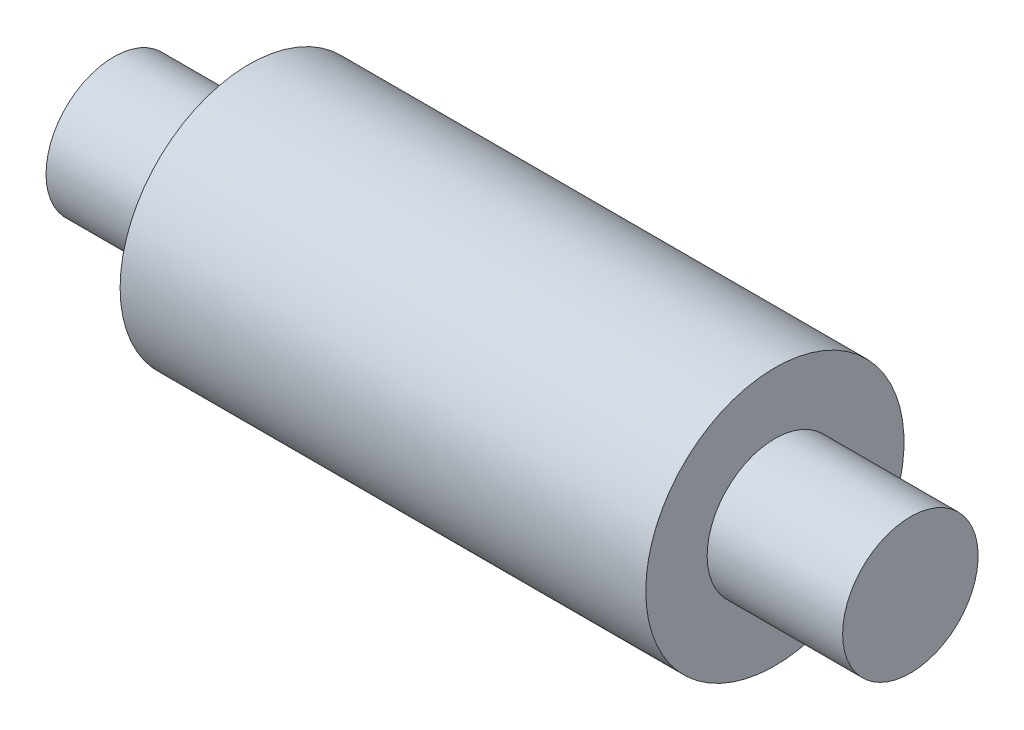
ISO-10303-21;
HEADER;
FILE_DESCRIPTION(('STEP AP214'),'2;1');
FILE_NAME('part.step','',(''),(''),'','','');
FILE_SCHEMA(('AUTOMOTIVE_DESIGN { 1 0 10303 214 1 1 1 1 }'));
ENDSEC;
DATA;
#1=APPLICATION_CONTEXT('core data for automotive mechanical design processes');
#2=APPLICATION_PROTOCOL_DEFINITION('international standard','automotive_design',2000,#1);
#3=PRODUCT_CONTEXT('',#1,'mechanical');
#4=PRODUCT('Part','Part','',(#3));
#5=PRODUCT_RELATED_PRODUCT_CATEGORY('part','',(#4));
#6=PRODUCT_DEFINITION_FORMATION('','',#4);
#7=PRODUCT_DEFINITION_CONTEXT('part definition',#1,'design');
#8=PRODUCT_DEFINITION('design','',#6,#7);
#9=PRODUCT_DEFINITION_SHAPE('','',#8);
#10=(LENGTH_UNIT() NAMED_UNIT(*) SI_UNIT(.MILLI.,.METRE.));
#11=(NAMED_UNIT(*) PLANE_ANGLE_UNIT() SI_UNIT($,.RADIAN.));
#12=(NAMED_UNIT(*) SI_UNIT($,.STERADIAN.) SOLID_ANGLE_UNIT());
#13=UNCERTAINTY_MEASURE_WITH_UNIT(LENGTH_MEASURE(1.E-05),#10,'distance_accuracy_value','');
#14=(GEOMETRIC_REPRESENTATION_CONTEXT(3) GLOBAL_UNCERTAINTY_ASSIGNED_CONTEXT((#13)) GLOBAL_UNIT_ASSIGNED_CONTEXT((#10,
#11,#12)) REPRESENTATION_CONTEXT('',''));
#15=CARTESIAN_POINT('',(0.,0.,0.));
#16=DIRECTION('',(0.,0.,1.));
#17=DIRECTION('',(1.,0.,0.));
#18=AXIS2_PLACEMENT_3D('',#15,#16,#17);
#19=CARTESIAN_POINT('',(-37.338,6.35,0.));
#20=DIRECTION('',(1.,0.,0.));
#21=DIRECTION('',(0.,0.,-1.));
#22=AXIS2_PLACEMENT_3D('',#19,#20,#21);
#23=PLANE('',#22);
#24=CARTESIAN_POINT('',(-37.338,0.,0.));
#25=DIRECTION('',(-1.,0.,0.));
#26=DIRECTION('',(0.,0.,1.));
#27=AXIS2_PLACEMENT_3D('',#24,#25,#26);
#28=CIRCLE('',#27,6.35);
#29=CARTESIAN_POINT('',(-37.338,0.,6.35));
#30=VERTEX_POINT('',#29);
#31=EDGE_CURVE('E61',#30,#30,#28,.T.);
#32=ORIENTED_EDGE('',*,*,#31,.T.);
#33=EDGE_LOOP('',(#32));
#34=FACE_BOUND('',#33,.T.);
#35=ADVANCED_FACE('F39',(#34),#23,.F.);
#36=CARTESIAN_POINT('',(37.338,0.,0.));
#37=DIRECTION('',(-1.,0.,0.));
#38=DIRECTION('',(0.,0.,1.));
#39=AXIS2_PLACEMENT_3D('',#36,#37,#38);
#40=PLANE('',#39);
#41=CARTESIAN_POINT('',(37.338,0.,0.));
#42=DIRECTION('',(-1.,0.,0.));
#43=DIRECTION('',(0.,0.,1.));
#44=AXIS2_PLACEMENT_3D('',#41,#42,#43);
#45=CIRCLE('',#44,6.35000000000001);
#46=CARTESIAN_POINT('',(37.338,0.,6.35000000000001));
#47=VERTEX_POINT('',#46);
#48=EDGE_CURVE('E10',#47,#47,#45,.T.);
#49=ORIENTED_EDGE('',*,*,#48,.F.);
#50=EDGE_LOOP('',(#49));
#51=FACE_BOUND('',#50,.T.);
#52=ADVANCED_FACE('F91',(#51),#40,.F.);
#53=CARTESIAN_POINT('',(-37.338,0.,0.));
#54=DIRECTION('',(-1.,0.,0.));
#55=DIRECTION('',(0.,0.,1.));
#56=AXIS2_PLACEMENT_3D('',#53,#54,#55);
#57=CYLINDRICAL_SURFACE('',#56,6.35);
#58=CARTESIAN_POINT('',(24.638,0.,0.));
#59=DIRECTION('',(-1.,0.,0.));
#60=DIRECTION('',(0.,0.,1.));
#61=AXIS2_PLACEMENT_3D('',#58,#59,#60);
#62=CIRCLE('',#61,6.35);
#63=CARTESIAN_POINT('',(24.638,0.,6.35));
#64=VERTEX_POINT('',#63);
#65=EDGE_CURVE('E45',#64,#64,#62,.T.);
#66=ORIENTED_EDGE('',*,*,#65,.F.);
#67=EDGE_LOOP('',(#66));
#68=FACE_BOUND('',#67,.T.);
#69=ORIENTED_EDGE('',*,*,#48,.T.);
#70=EDGE_LOOP('',(#69));
#71=FACE_BOUND('',#70,.T.);
#72=ADVANCED_FACE('F86',(#68,#71),#57,.T.);
#73=CARTESIAN_POINT('',(24.638,6.35,0.));
#74=DIRECTION('',(-1.,0.,0.));
#75=DIRECTION('',(0.,0.,1.));
#76=AXIS2_PLACEMENT_3D('',#73,#74,#75);
#77=PLANE('',#76);
#78=CARTESIAN_POINT('',(24.638,0.,0.));
#79=DIRECTION('',(-1.,0.,0.));
#80=DIRECTION('',(0.,0.,1.));
#81=AXIS2_PLACEMENT_3D('',#78,#79,#80);
#82=CIRCLE('',#81,12.1031);
#83=CARTESIAN_POINT('',(24.638,0.,12.1031));
#84=VERTEX_POINT('',#83);
#85=EDGE_CURVE('E49',#84,#84,#82,.T.);
#86=ORIENTED_EDGE('',*,*,#85,.F.);
#87=EDGE_LOOP('',(#86));
#88=FACE_BOUND('',#87,.T.);
#89=ORIENTED_EDGE('',*,*,#65,.T.);
#90=EDGE_LOOP('',(#89));
#91=FACE_BOUND('',#90,.T.);
#92=ADVANCED_FACE('F81',(#88,#91),#77,.F.);
#93=CARTESIAN_POINT('',(-37.338,0.,0.));
#94=DIRECTION('',(-1.,0.,0.));
#95=DIRECTION('',(0.,0.,1.));
#96=AXIS2_PLACEMENT_3D('',#93,#94,#95);
#97=CYLINDRICAL_SURFACE('',#96,12.1031);
#98=CARTESIAN_POINT('',(-24.638,0.,0.));
#99=DIRECTION('',(-1.,0.,0.));
#100=DIRECTION('',(0.,0.,1.));
#101=AXIS2_PLACEMENT_3D('',#98,#99,#100);
#102=CIRCLE('',#101,12.1031);
#103=CARTESIAN_POINT('',(-24.638,0.,12.1031));
#104=VERTEX_POINT('',#103);
#105=EDGE_CURVE('E53',#104,#104,#102,.T.);
#106=ORIENTED_EDGE('',*,*,#105,.F.);
#107=EDGE_LOOP('',(#106));
#108=FACE_BOUND('',#107,.T.);
#109=ORIENTED_EDGE('',*,*,#85,.T.);
#110=EDGE_LOOP('',(#109));
#111=FACE_BOUND('',#110,.T.);
#112=ADVANCED_FACE('F75',(#108,#111),#97,.T.);
#113=CARTESIAN_POINT('',(-24.638,12.1031,0.));
#114=DIRECTION('',(1.,0.,0.));
#115=DIRECTION('',(0.,0.,-1.));
#116=AXIS2_PLACEMENT_3D('',#113,#114,#115);
#117=PLANE('',#116);
#118=CARTESIAN_POINT('',(-24.638,0.,0.));
#119=DIRECTION('',(-1.,0.,0.));
#120=DIRECTION('',(0.,0.,1.));
#121=AXIS2_PLACEMENT_3D('',#118,#119,#120);
#122=CIRCLE('',#121,6.35);
#123=CARTESIAN_POINT('',(-24.638,0.,6.35));
#124=VERTEX_POINT('',#123);
#125=EDGE_CURVE('E58',#124,#124,#122,.T.);
#126=ORIENTED_EDGE('',*,*,#125,.F.);
#127=EDGE_LOOP('',(#126));
#128=FACE_BOUND('',#127,.T.);
#129=ORIENTED_EDGE('',*,*,#105,.T.);
#130=EDGE_LOOP('',(#129));
#131=FACE_BOUND('',#130,.T.);
#132=ADVANCED_FACE('F69',(#128,#131),#117,.F.);
#133=CARTESIAN_POINT('',(-37.338,0.,0.));
#134=DIRECTION('',(-1.,0.,0.));
#135=DIRECTION('',(0.,0.,1.));
#136=AXIS2_PLACEMENT_3D('',#133,#134,#135);
#137=CYLINDRICAL_SURFACE('',#136,6.35);
#138=ORIENTED_EDGE('',*,*,#31,.F.);
#139=EDGE_LOOP('',(#138));
#140=FACE_BOUND('',#139,.T.);
#141=ORIENTED_EDGE('',*,*,#125,.T.);
#142=EDGE_LOOP('',(#141));
#143=FACE_BOUND('',#142,.T.);
#144=ADVANCED_FACE('F66',(#140,#143),#137,.T.);
#145=CLOSED_SHELL('',(#35,#52,#72,#92,#112,#132,#144));
#146=MANIFOLD_SOLID_BREP('B2',#145);
#147=ADVANCED_BREP_SHAPE_REPRESENTATION('',(#18,#146),#14);
#148=SHAPE_DEFINITION_REPRESENTATION(#9,#147);
ENDSEC;
END-ISO-10303-21;
